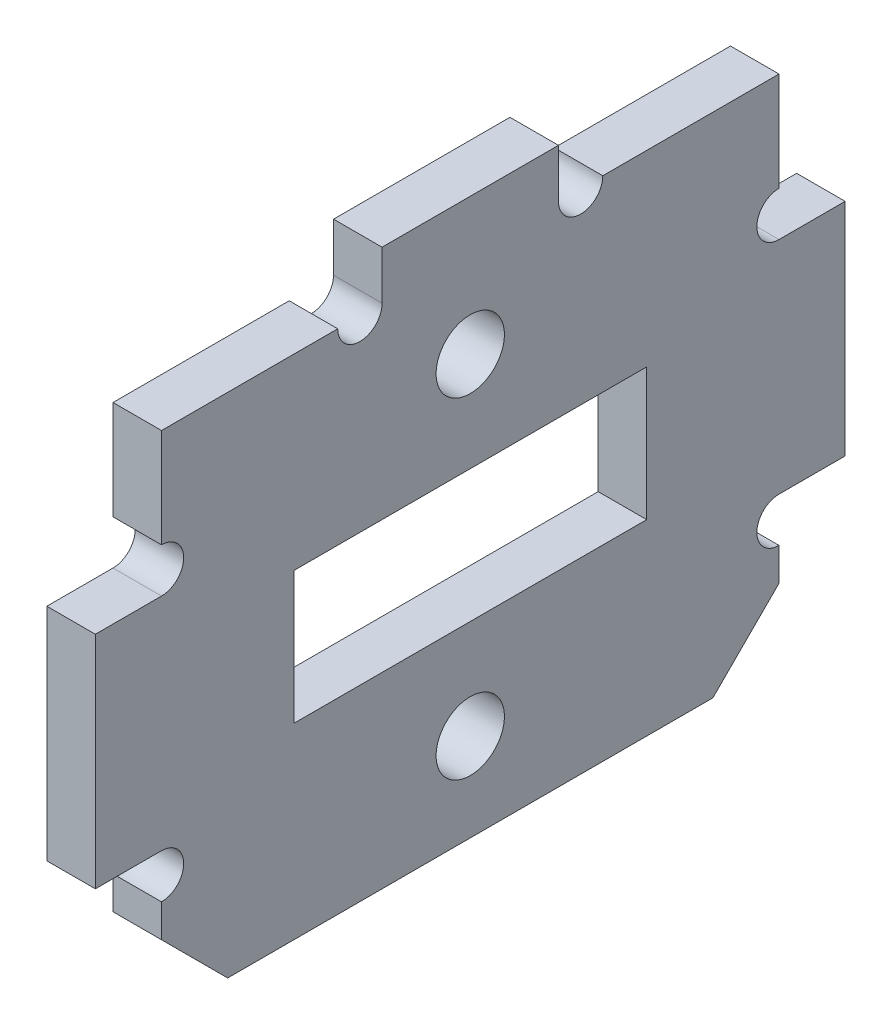
ISO-10303-21;
HEADER;
FILE_DESCRIPTION(('STEP AP214'),'2;1');
FILE_NAME('part.step','',(''),(''),'','','');
FILE_SCHEMA(('AUTOMOTIVE_DESIGN { 1 0 10303 214 1 1 1 1 }'));
ENDSEC;
DATA;
#1=APPLICATION_CONTEXT('core data for automotive mechanical design processes');
#2=APPLICATION_PROTOCOL_DEFINITION('international standard','automotive_design',2000,#1);
#3=PRODUCT_CONTEXT('',#1,'mechanical');
#4=PRODUCT('Part','Part','',(#3));
#5=PRODUCT_RELATED_PRODUCT_CATEGORY('part','',(#4));
#6=PRODUCT_DEFINITION_FORMATION('','',#4);
#7=PRODUCT_DEFINITION_CONTEXT('part definition',#1,'design');
#8=PRODUCT_DEFINITION('design','',#6,#7);
#9=PRODUCT_DEFINITION_SHAPE('','',#8);
#10=(LENGTH_UNIT() NAMED_UNIT(*) SI_UNIT(.MILLI.,.METRE.));
#11=(NAMED_UNIT(*) PLANE_ANGLE_UNIT() SI_UNIT($,.RADIAN.));
#12=(NAMED_UNIT(*) SI_UNIT($,.STERADIAN.) SOLID_ANGLE_UNIT());
#13=UNCERTAINTY_MEASURE_WITH_UNIT(LENGTH_MEASURE(1.E-05),#10,'distance_accuracy_value','');
#14=(GEOMETRIC_REPRESENTATION_CONTEXT(3) GLOBAL_UNCERTAINTY_ASSIGNED_CONTEXT((#13)) GLOBAL_UNIT_ASSIGNED_CONTEXT((#10,
#11,#12)) REPRESENTATION_CONTEXT('',''));
#15=CARTESIAN_POINT('',(0.,0.,0.));
#16=DIRECTION('',(0.,0.,1.));
#17=DIRECTION('',(1.,0.,0.));
#18=AXIS2_PLACEMENT_3D('',#15,#16,#17);
#19=CARTESIAN_POINT('',(2.2,5.,0.));
#20=DIRECTION('',(0.,1.,0.));
#21=DIRECTION('',(0.,0.,1.));
#22=AXIS2_PLACEMENT_3D('',#19,#20,#21);
#23=PLANE('',#22);
#24=DIRECTION('',(0.,0.,-1.));
#25=VECTOR('',#24,1.);
#26=CARTESIAN_POINT('',(0.,5.,0.));
#27=LINE('',#26,#25);
#28=CARTESIAN_POINT('',(0.,5.,-14.));
#29=VERTEX_POINT('',#28);
#30=CARTESIAN_POINT('',(0.,5.,-17.));
#31=VERTEX_POINT('',#30);
#32=EDGE_CURVE('E375',#29,#31,#27,.T.);
#33=ORIENTED_EDGE('',*,*,#32,.F.);
#34=DIRECTION('',(-1.,0.,0.));
#35=VECTOR('',#34,1.);
#36=CARTESIAN_POINT('',(2.2,5.,-14.));
#37=LINE('',#36,#35);
#38=CARTESIAN_POINT('',(2.2,5.,-14.));
#39=VERTEX_POINT('',#38);
#40=EDGE_CURVE('E259',#39,#29,#37,.T.);
#41=ORIENTED_EDGE('',*,*,#40,.F.);
#42=DIRECTION('',(0.,0.,-1.));
#43=VECTOR('',#42,1.);
#44=CARTESIAN_POINT('',(2.2,5.,0.));
#45=LINE('',#44,#43);
#46=CARTESIAN_POINT('',(2.2,5.,-17.));
#47=VERTEX_POINT('',#46);
#48=EDGE_CURVE('E502',#39,#47,#45,.T.);
#49=ORIENTED_EDGE('',*,*,#48,.T.);
#50=DIRECTION('',(-1.,0.,0.));
#51=VECTOR('',#50,1.);
#52=CARTESIAN_POINT('',(2.2,5.,-17.));
#53=LINE('',#52,#51);
#54=EDGE_CURVE('E247',#47,#31,#53,.T.);
#55=ORIENTED_EDGE('',*,*,#54,.T.);
#56=EDGE_LOOP('',(#33,#41,#49,#55));
#57=FACE_BOUND('',#56,.T.);
#58=ADVANCED_FACE('F36',(#57),#23,.T.);
#59=CARTESIAN_POINT('',(2.2,6.005,-14.));
#60=DIRECTION('',(-1.,0.,0.));
#61=DIRECTION('',(0.,0.,1.));
#62=AXIS2_PLACEMENT_3D('',#59,#60,#61);
#63=CYLINDRICAL_SURFACE('',#62,1.005);
#64=CARTESIAN_POINT('',(0.,6.005,-14.));
#65=DIRECTION('',(1.,0.,0.));
#66=DIRECTION('',(0.,0.,-1.));
#67=AXIS2_PLACEMENT_3D('',#64,#65,#66);
#68=CIRCLE('',#67,1.005);
#69=CARTESIAN_POINT('',(0.,7.01,-14.));
#70=VERTEX_POINT('',#69);
#71=EDGE_CURVE('E378',#29,#70,#68,.F.);
#72=ORIENTED_EDGE('',*,*,#71,.T.);
#73=DIRECTION('',(-1.,0.,0.));
#74=VECTOR('',#73,1.);
#75=CARTESIAN_POINT('',(2.2,7.01,-14.));
#76=LINE('',#75,#74);
#77=CARTESIAN_POINT('',(2.2,7.01,-14.));
#78=VERTEX_POINT('',#77);
#79=EDGE_CURVE('E346',#78,#70,#76,.T.);
#80=ORIENTED_EDGE('',*,*,#79,.F.);
#81=CARTESIAN_POINT('',(2.2,6.005,-14.));
#82=DIRECTION('',(1.,0.,0.));
#83=DIRECTION('',(0.,0.,-1.));
#84=AXIS2_PLACEMENT_3D('',#81,#82,#83);
#85=CIRCLE('',#84,1.005);
#86=EDGE_CURVE('E545',#39,#78,#85,.F.);
#87=ORIENTED_EDGE('',*,*,#86,.F.);
#88=ORIENTED_EDGE('',*,*,#40,.T.);
#89=EDGE_LOOP('',(#72,#80,#87,#88));
#90=FACE_BOUND('',#89,.T.);
#91=ADVANCED_FACE('F496',(#90),#63,.F.);
#92=CARTESIAN_POINT('',(2.2,0.,-14.));
#93=DIRECTION('',(0.,0.,1.));
#94=DIRECTION('',(1.,0.,0.));
#95=AXIS2_PLACEMENT_3D('',#92,#93,#94);
#96=PLANE('',#95);
#97=DIRECTION('',(0.,1.,0.));
#98=VECTOR('',#97,1.);
#99=CARTESIAN_POINT('',(0.,0.,-14.));
#100=LINE('',#99,#98);
#101=CARTESIAN_POINT('',(0.,11.5,-14.));
#102=VERTEX_POINT('',#101);
#103=EDGE_CURVE('E381',#70,#102,#100,.T.);
#104=ORIENTED_EDGE('',*,*,#103,.T.);
#105=DIRECTION('',(-1.,0.,0.));
#106=VECTOR('',#105,1.);
#107=CARTESIAN_POINT('',(2.2,11.5,-14.));
#108=LINE('',#107,#106);
#109=CARTESIAN_POINT('',(2.2,11.5,-14.));
#110=VERTEX_POINT('',#109);
#111=EDGE_CURVE('E343',#110,#102,#108,.T.);
#112=ORIENTED_EDGE('',*,*,#111,.F.);
#113=DIRECTION('',(0.,1.,0.));
#114=VECTOR('',#113,1.);
#115=CARTESIAN_POINT('',(2.2,0.,-14.));
#116=LINE('',#115,#114);
#117=EDGE_CURVE('E492',#78,#110,#116,.T.);
#118=ORIENTED_EDGE('',*,*,#117,.F.);
#119=ORIENTED_EDGE('',*,*,#79,.T.);
#120=EDGE_LOOP('',(#104,#112,#118,#119));
#121=FACE_BOUND('',#120,.T.);
#122=ADVANCED_FACE('F490',(#121),#96,.F.);
#123=CARTESIAN_POINT('',(2.2,11.5,0.));
#124=DIRECTION('',(0.,-1.,0.));
#125=DIRECTION('',(0.,0.,-1.));
#126=AXIS2_PLACEMENT_3D('',#123,#124,#125);
#127=PLANE('',#126);
#128=DIRECTION('',(0.,0.,1.));
#129=VECTOR('',#128,1.);
#130=CARTESIAN_POINT('',(0.,11.5,0.));
#131=LINE('',#130,#129);
#132=CARTESIAN_POINT('',(0.,11.5,-6.01));
#133=VERTEX_POINT('',#132);
#134=EDGE_CURVE('E384',#102,#133,#131,.T.);
#135=ORIENTED_EDGE('',*,*,#134,.T.);
#136=DIRECTION('',(-1.,0.,0.));
#137=VECTOR('',#136,1.);
#138=CARTESIAN_POINT('',(2.2,11.5,-6.01));
#139=LINE('',#138,#137);
#140=CARTESIAN_POINT('',(2.2,11.5,-6.01));
#141=VERTEX_POINT('',#140);
#142=EDGE_CURVE('E341',#141,#133,#139,.T.);
#143=ORIENTED_EDGE('',*,*,#142,.F.);
#144=DIRECTION('',(0.,0.,1.));
#145=VECTOR('',#144,1.);
#146=CARTESIAN_POINT('',(2.2,11.5,0.));
#147=LINE('',#146,#145);
#148=EDGE_CURVE('E487',#110,#141,#147,.T.);
#149=ORIENTED_EDGE('',*,*,#148,.F.);
#150=ORIENTED_EDGE('',*,*,#111,.T.);
#151=EDGE_LOOP('',(#135,#143,#149,#150));
#152=FACE_BOUND('',#151,.T.);
#153=ADVANCED_FACE('F486',(#152),#127,.F.);
#154=CARTESIAN_POINT('',(2.2,11.5,-5.005));
#155=DIRECTION('',(-1.,0.,0.));
#156=DIRECTION('',(0.,0.,1.));
#157=AXIS2_PLACEMENT_3D('',#154,#155,#156);
#158=CYLINDRICAL_SURFACE('',#157,1.005);
#159=CARTESIAN_POINT('',(0.,11.5,-5.005));
#160=DIRECTION('',(1.,0.,0.));
#161=DIRECTION('',(0.,0.,-1.));
#162=AXIS2_PLACEMENT_3D('',#159,#160,#161);
#163=CIRCLE('',#162,1.005);
#164=CARTESIAN_POINT('',(0.,11.5,-4.));
#165=VERTEX_POINT('',#164);
#166=EDGE_CURVE('E387',#165,#133,#163,.T.);
#167=ORIENTED_EDGE('',*,*,#166,.F.);
#168=DIRECTION('',(-1.,0.,0.));
#169=VECTOR('',#168,1.);
#170=CARTESIAN_POINT('',(2.2,11.5,-4.));
#171=LINE('',#170,#169);
#172=CARTESIAN_POINT('',(2.2,11.5,-4.));
#173=VERTEX_POINT('',#172);
#174=EDGE_CURVE('E339',#173,#165,#171,.T.);
#175=ORIENTED_EDGE('',*,*,#174,.F.);
#176=CARTESIAN_POINT('',(2.2,11.5,-5.005));
#177=DIRECTION('',(1.,0.,0.));
#178=DIRECTION('',(0.,0.,-1.));
#179=AXIS2_PLACEMENT_3D('',#176,#177,#178);
#180=CIRCLE('',#179,1.005);
#181=EDGE_CURVE('E541',#173,#141,#180,.T.);
#182=ORIENTED_EDGE('',*,*,#181,.T.);
#183=ORIENTED_EDGE('',*,*,#142,.T.);
#184=EDGE_LOOP('',(#167,#175,#182,#183));
#185=FACE_BOUND('',#184,.T.);
#186=ADVANCED_FACE('F481',(#185),#158,.F.);
#187=CARTESIAN_POINT('',(2.2,0.,-4.));
#188=DIRECTION('',(0.,0.,-1.));
#189=DIRECTION('',(-1.,0.,0.));
#190=AXIS2_PLACEMENT_3D('',#187,#188,#189);
#191=PLANE('',#190);
#192=DIRECTION('',(0.,-1.,0.));
#193=VECTOR('',#192,1.);
#194=CARTESIAN_POINT('',(0.,0.,-4.));
#195=LINE('',#194,#193);
#196=CARTESIAN_POINT('',(0.,13.7,-4.));
#197=VERTEX_POINT('',#196);
#198=EDGE_CURVE('E390',#197,#165,#195,.T.);
#199=ORIENTED_EDGE('',*,*,#198,.F.);
#200=DIRECTION('',(-1.,0.,0.));
#201=VECTOR('',#200,1.);
#202=CARTESIAN_POINT('',(2.2,13.7,-4.));
#203=LINE('',#202,#201);
#204=CARTESIAN_POINT('',(2.2,13.7,-4.));
#205=VERTEX_POINT('',#204);
#206=EDGE_CURVE('E337',#205,#197,#203,.T.);
#207=ORIENTED_EDGE('',*,*,#206,.F.);
#208=DIRECTION('',(0.,-1.,0.));
#209=VECTOR('',#208,1.);
#210=CARTESIAN_POINT('',(2.2,0.,-4.));
#211=LINE('',#210,#209);
#212=EDGE_CURVE('E477',#205,#173,#211,.T.);
#213=ORIENTED_EDGE('',*,*,#212,.T.);
#214=ORIENTED_EDGE('',*,*,#174,.T.);
#215=EDGE_LOOP('',(#199,#207,#213,#214));
#216=FACE_BOUND('',#215,.T.);
#217=ADVANCED_FACE('F475',(#216),#191,.T.);
#218=CARTESIAN_POINT('',(2.2,13.7,0.));
#219=DIRECTION('',(0.,1.,0.));
#220=DIRECTION('',(0.,0.,1.));
#221=AXIS2_PLACEMENT_3D('',#218,#219,#220);
#222=PLANE('',#221);
#223=DIRECTION('',(0.,0.,-1.));
#224=VECTOR('',#223,1.);
#225=CARTESIAN_POINT('',(0.,13.7,0.));
#226=LINE('',#225,#224);
#227=CARTESIAN_POINT('',(0.,13.7,4.));
#228=VERTEX_POINT('',#227);
#229=EDGE_CURVE('E393',#228,#197,#226,.T.);
#230=ORIENTED_EDGE('',*,*,#229,.F.);
#231=DIRECTION('',(-1.,0.,0.));
#232=VECTOR('',#231,1.);
#233=CARTESIAN_POINT('',(2.2,13.7,4.));
#234=LINE('',#233,#232);
#235=CARTESIAN_POINT('',(2.2,13.7,4.));
#236=VERTEX_POINT('',#235);
#237=EDGE_CURVE('E335',#236,#228,#234,.T.);
#238=ORIENTED_EDGE('',*,*,#237,.F.);
#239=DIRECTION('',(0.,0.,-1.));
#240=VECTOR('',#239,1.);
#241=CARTESIAN_POINT('',(2.2,13.7,0.));
#242=LINE('',#241,#240);
#243=EDGE_CURVE('E471',#236,#205,#242,.T.);
#244=ORIENTED_EDGE('',*,*,#243,.T.);
#245=ORIENTED_EDGE('',*,*,#206,.T.);
#246=EDGE_LOOP('',(#230,#238,#244,#245));
#247=FACE_BOUND('',#246,.T.);
#248=ADVANCED_FACE('F468',(#247),#222,.T.);
#249=CARTESIAN_POINT('',(2.2,0.,4.));
#250=DIRECTION('',(0.,0.,1.));
#251=DIRECTION('',(1.,0.,0.));
#252=AXIS2_PLACEMENT_3D('',#249,#250,#251);
#253=PLANE('',#252);
#254=DIRECTION('',(0.,1.,0.));
#255=VECTOR('',#254,1.);
#256=CARTESIAN_POINT('',(0.,0.,4.));
#257=LINE('',#256,#255);
#258=CARTESIAN_POINT('',(0.,11.5,4.));
#259=VERTEX_POINT('',#258);
#260=EDGE_CURVE('E396',#259,#228,#257,.T.);
#261=ORIENTED_EDGE('',*,*,#260,.F.);
#262=DIRECTION('',(-1.,0.,0.));
#263=VECTOR('',#262,1.);
#264=CARTESIAN_POINT('',(2.2,11.5,4.));
#265=LINE('',#264,#263);
#266=CARTESIAN_POINT('',(2.2,11.5,4.));
#267=VERTEX_POINT('',#266);
#268=EDGE_CURVE('E333',#267,#259,#265,.T.);
#269=ORIENTED_EDGE('',*,*,#268,.F.);
#270=DIRECTION('',(0.,1.,0.));
#271=VECTOR('',#270,1.);
#272=CARTESIAN_POINT('',(2.2,0.,4.));
#273=LINE('',#272,#271);
#274=EDGE_CURVE('E537',#267,#236,#273,.T.);
#275=ORIENTED_EDGE('',*,*,#274,.T.);
#276=ORIENTED_EDGE('',*,*,#237,.T.);
#277=EDGE_LOOP('',(#261,#269,#275,#276));
#278=FACE_BOUND('',#277,.T.);
#279=ADVANCED_FACE('F464',(#278),#253,.T.);
#280=CARTESIAN_POINT('',(2.2,11.5,5.005));
#281=DIRECTION('',(-1.,0.,0.));
#282=DIRECTION('',(0.,0.,1.));
#283=AXIS2_PLACEMENT_3D('',#280,#281,#282);
#284=CYLINDRICAL_SURFACE('',#283,1.005);
#285=CARTESIAN_POINT('',(0.,11.5,5.005));
#286=DIRECTION('',(1.,0.,0.));
#287=DIRECTION('',(0.,0.,-1.));
#288=AXIS2_PLACEMENT_3D('',#285,#286,#287);
#289=CIRCLE('',#288,1.005);
#290=CARTESIAN_POINT('',(0.,11.5,6.01));
#291=VERTEX_POINT('',#290);
#292=EDGE_CURVE('E399',#291,#259,#289,.T.);
#293=ORIENTED_EDGE('',*,*,#292,.F.);
#294=DIRECTION('',(-1.,0.,0.));
#295=VECTOR('',#294,1.);
#296=CARTESIAN_POINT('',(2.2,11.5,6.01));
#297=LINE('',#296,#295);
#298=CARTESIAN_POINT('',(2.2,11.5,6.01));
#299=VERTEX_POINT('',#298);
#300=EDGE_CURVE('E331',#299,#291,#297,.T.);
#301=ORIENTED_EDGE('',*,*,#300,.F.);
#302=CARTESIAN_POINT('',(2.2,11.5,5.005));
#303=DIRECTION('',(1.,0.,0.));
#304=DIRECTION('',(0.,0.,-1.));
#305=AXIS2_PLACEMENT_3D('',#302,#303,#304);
#306=CIRCLE('',#305,1.005);
#307=EDGE_CURVE('E460',#299,#267,#306,.T.);
#308=ORIENTED_EDGE('',*,*,#307,.T.);
#309=ORIENTED_EDGE('',*,*,#268,.T.);
#310=EDGE_LOOP('',(#293,#301,#308,#309));
#311=FACE_BOUND('',#310,.T.);
#312=ADVANCED_FACE('F455',(#311),#284,.F.);
#313=CARTESIAN_POINT('',(2.2,11.5,0.));
#314=DIRECTION('',(0.,-1.,0.));
#315=DIRECTION('',(0.,0.,-1.));
#316=AXIS2_PLACEMENT_3D('',#313,#314,#315);
#317=PLANE('',#316);
#318=DIRECTION('',(0.,0.,1.));
#319=VECTOR('',#318,1.);
#320=CARTESIAN_POINT('',(0.,11.5,0.));
#321=LINE('',#320,#319);
#322=CARTESIAN_POINT('',(0.,11.5,14.));
#323=VERTEX_POINT('',#322);
#324=EDGE_CURVE('E402',#291,#323,#321,.T.);
#325=ORIENTED_EDGE('',*,*,#324,.T.);
#326=DIRECTION('',(-1.,0.,0.));
#327=VECTOR('',#326,1.);
#328=CARTESIAN_POINT('',(2.2,11.5,14.));
#329=LINE('',#328,#327);
#330=CARTESIAN_POINT('',(2.2,11.5,14.));
#331=VERTEX_POINT('',#330);
#332=EDGE_CURVE('E329',#331,#323,#329,.T.);
#333=ORIENTED_EDGE('',*,*,#332,.F.);
#334=DIRECTION('',(0.,0.,1.));
#335=VECTOR('',#334,1.);
#336=CARTESIAN_POINT('',(2.2,11.5,0.));
#337=LINE('',#336,#335);
#338=EDGE_CURVE('E534',#299,#331,#337,.T.);
#339=ORIENTED_EDGE('',*,*,#338,.F.);
#340=ORIENTED_EDGE('',*,*,#300,.T.);
#341=EDGE_LOOP('',(#325,#333,#339,#340));
#342=FACE_BOUND('',#341,.T.);
#343=ADVANCED_FACE('F622',(#342),#317,.F.);
#344=CARTESIAN_POINT('',(2.2,0.,14.));
#345=DIRECTION('',(0.,0.,1.));
#346=DIRECTION('',(1.,0.,0.));
#347=AXIS2_PLACEMENT_3D('',#344,#345,#346);
#348=PLANE('',#347);
#349=DIRECTION('',(0.,1.,0.));
#350=VECTOR('',#349,1.);
#351=CARTESIAN_POINT('',(0.,0.,14.));
#352=LINE('',#351,#350);
#353=CARTESIAN_POINT('',(0.,7.01,14.));
#354=VERTEX_POINT('',#353);
#355=EDGE_CURVE('E405',#354,#323,#352,.T.);
#356=ORIENTED_EDGE('',*,*,#355,.F.);
#357=DIRECTION('',(-1.,0.,0.));
#358=VECTOR('',#357,1.);
#359=CARTESIAN_POINT('',(2.2,7.01,14.));
#360=LINE('',#359,#358);
#361=CARTESIAN_POINT('',(2.2,7.01,14.));
#362=VERTEX_POINT('',#361);
#363=EDGE_CURVE('E327',#362,#354,#360,.T.);
#364=ORIENTED_EDGE('',*,*,#363,.F.);
#365=DIRECTION('',(0.,1.,0.));
#366=VECTOR('',#365,1.);
#367=CARTESIAN_POINT('',(2.2,0.,14.));
#368=LINE('',#367,#366);
#369=EDGE_CURVE('E532',#362,#331,#368,.T.);
#370=ORIENTED_EDGE('',*,*,#369,.T.);
#371=ORIENTED_EDGE('',*,*,#332,.T.);
#372=EDGE_LOOP('',(#356,#364,#370,#371));
#373=FACE_BOUND('',#372,.T.);
#374=ADVANCED_FACE('F449',(#373),#348,.T.);
#375=CARTESIAN_POINT('',(2.2,6.005,14.));
#376=DIRECTION('',(-1.,0.,0.));
#377=DIRECTION('',(0.,0.,1.));
#378=AXIS2_PLACEMENT_3D('',#375,#376,#377);
#379=CYLINDRICAL_SURFACE('',#378,1.005);
#380=CARTESIAN_POINT('',(0.,6.005,14.));
#381=DIRECTION('',(1.,0.,0.));
#382=DIRECTION('',(0.,0.,-1.));
#383=AXIS2_PLACEMENT_3D('',#380,#381,#382);
#384=CIRCLE('',#383,1.005);
#385=CARTESIAN_POINT('',(0.,5.,14.));
#386=VERTEX_POINT('',#385);
#387=EDGE_CURVE('E408',#386,#354,#384,.T.);
#388=ORIENTED_EDGE('',*,*,#387,.F.);
#389=DIRECTION('',(-1.,0.,0.));
#390=VECTOR('',#389,1.);
#391=CARTESIAN_POINT('',(2.2,5.,14.));
#392=LINE('',#391,#390);
#393=CARTESIAN_POINT('',(2.2,5.,14.));
#394=VERTEX_POINT('',#393);
#395=EDGE_CURVE('E325',#394,#386,#392,.T.);
#396=ORIENTED_EDGE('',*,*,#395,.F.);
#397=CARTESIAN_POINT('',(2.2,6.005,14.));
#398=DIRECTION('',(1.,0.,0.));
#399=DIRECTION('',(0.,0.,-1.));
#400=AXIS2_PLACEMENT_3D('',#397,#398,#399);
#401=CIRCLE('',#400,1.005);
#402=EDGE_CURVE('E445',#394,#362,#401,.T.);
#403=ORIENTED_EDGE('',*,*,#402,.T.);
#404=ORIENTED_EDGE('',*,*,#363,.T.);
#405=EDGE_LOOP('',(#388,#396,#403,#404));
#406=FACE_BOUND('',#405,.T.);
#407=ADVANCED_FACE('F440',(#406),#379,.F.);
#408=CARTESIAN_POINT('',(2.2,5.,0.));
#409=DIRECTION('',(0.,-1.,0.));
#410=DIRECTION('',(0.,0.,-1.));
#411=AXIS2_PLACEMENT_3D('',#408,#409,#410);
#412=PLANE('',#411);
#413=DIRECTION('',(0.,0.,1.));
#414=VECTOR('',#413,1.);
#415=CARTESIAN_POINT('',(0.,5.,0.));
#416=LINE('',#415,#414);
#417=CARTESIAN_POINT('',(0.,5.,17.));
#418=VERTEX_POINT('',#417);
#419=EDGE_CURVE('E411',#386,#418,#416,.T.);
#420=ORIENTED_EDGE('',*,*,#419,.T.);
#421=DIRECTION('',(-1.,0.,0.));
#422=VECTOR('',#421,1.);
#423=CARTESIAN_POINT('',(2.2,5.,17.));
#424=LINE('',#423,#422);
#425=CARTESIAN_POINT('',(2.2,5.,17.));
#426=VERTEX_POINT('',#425);
#427=EDGE_CURVE('E322',#426,#418,#424,.T.);
#428=ORIENTED_EDGE('',*,*,#427,.F.);
#429=DIRECTION('',(0.,0.,1.));
#430=VECTOR('',#429,1.);
#431=CARTESIAN_POINT('',(2.2,5.,0.));
#432=LINE('',#431,#430);
#433=EDGE_CURVE('E528',#394,#426,#432,.T.);
#434=ORIENTED_EDGE('',*,*,#433,.F.);
#435=ORIENTED_EDGE('',*,*,#395,.T.);
#436=EDGE_LOOP('',(#420,#428,#434,#435));
#437=FACE_BOUND('',#436,.T.);
#438=ADVANCED_FACE('F615',(#437),#412,.F.);
#439=CARTESIAN_POINT('',(2.2,0.,17.));
#440=DIRECTION('',(0.,0.,-1.));
#441=DIRECTION('',(-1.,0.,0.));
#442=AXIS2_PLACEMENT_3D('',#439,#440,#441);
#443=PLANE('',#442);
#444=DIRECTION('',(0.,-1.,0.));
#445=VECTOR('',#444,1.);
#446=CARTESIAN_POINT('',(0.,0.,17.));
#447=LINE('',#446,#445);
#448=CARTESIAN_POINT('',(0.,-5.,17.));
#449=VERTEX_POINT('',#448);
#450=EDGE_CURVE('E414',#418,#449,#447,.T.);
#451=ORIENTED_EDGE('',*,*,#450,.T.);
#452=DIRECTION('',(-1.,0.,0.));
#453=VECTOR('',#452,1.);
#454=CARTESIAN_POINT('',(2.2,-5.,17.));
#455=LINE('',#454,#453);
#456=CARTESIAN_POINT('',(2.2,-5.,17.));
#457=VERTEX_POINT('',#456);
#458=EDGE_CURVE('E319',#457,#449,#455,.T.);
#459=ORIENTED_EDGE('',*,*,#458,.F.);
#460=DIRECTION('',(0.,-1.,0.));
#461=VECTOR('',#460,1.);
#462=CARTESIAN_POINT('',(2.2,0.,17.));
#463=LINE('',#462,#461);
#464=EDGE_CURVE('E526',#426,#457,#463,.T.);
#465=ORIENTED_EDGE('',*,*,#464,.F.);
#466=ORIENTED_EDGE('',*,*,#427,.T.);
#467=EDGE_LOOP('',(#451,#459,#465,#466));
#468=FACE_BOUND('',#467,.T.);
#469=ADVANCED_FACE('F434',(#468),#443,.F.);
#470=CARTESIAN_POINT('',(2.2,-5.,0.));
#471=DIRECTION('',(0.,1.,0.));
#472=DIRECTION('',(0.,0.,1.));
#473=AXIS2_PLACEMENT_3D('',#470,#471,#472);
#474=PLANE('',#473);
#475=DIRECTION('',(0.,0.,-1.));
#476=VECTOR('',#475,1.);
#477=CARTESIAN_POINT('',(0.,-5.,0.));
#478=LINE('',#477,#476);
#479=CARTESIAN_POINT('',(0.,-5.,14.));
#480=VERTEX_POINT('',#479);
#481=EDGE_CURVE('E417',#449,#480,#478,.T.);
#482=ORIENTED_EDGE('',*,*,#481,.T.);
#483=DIRECTION('',(-1.,0.,0.));
#484=VECTOR('',#483,1.);
#485=CARTESIAN_POINT('',(2.2,-5.,14.));
#486=LINE('',#485,#484);
#487=CARTESIAN_POINT('',(2.2,-5.,14.));
#488=VERTEX_POINT('',#487);
#489=EDGE_CURVE('E317',#488,#480,#486,.T.);
#490=ORIENTED_EDGE('',*,*,#489,.F.);
#491=DIRECTION('',(0.,0.,-1.));
#492=VECTOR('',#491,1.);
#493=CARTESIAN_POINT('',(2.2,-5.,0.));
#494=LINE('',#493,#492);
#495=EDGE_CURVE('E431',#457,#488,#494,.T.);
#496=ORIENTED_EDGE('',*,*,#495,.F.);
#497=ORIENTED_EDGE('',*,*,#458,.T.);
#498=EDGE_LOOP('',(#482,#490,#496,#497));
#499=FACE_BOUND('',#498,.T.);
#500=ADVANCED_FACE('F429',(#499),#474,.F.);
#501=CARTESIAN_POINT('',(2.2,-6.005,14.));
#502=DIRECTION('',(-1.,0.,0.));
#503=DIRECTION('',(0.,0.,1.));
#504=AXIS2_PLACEMENT_3D('',#501,#502,#503);
#505=CYLINDRICAL_SURFACE('',#504,1.005);
#506=CARTESIAN_POINT('',(0.,-6.005,14.));
#507=DIRECTION('',(1.,0.,0.));
#508=DIRECTION('',(0.,0.,-1.));
#509=AXIS2_PLACEMENT_3D('',#506,#507,#508);
#510=CIRCLE('',#509,1.005);
#511=CARTESIAN_POINT('',(0.,-7.01,14.));
#512=VERTEX_POINT('',#511);
#513=EDGE_CURVE('E299',#512,#480,#510,.T.);
#514=ORIENTED_EDGE('',*,*,#513,.F.);
#515=DIRECTION('',(-1.,0.,0.));
#516=VECTOR('',#515,1.);
#517=CARTESIAN_POINT('',(2.2,-7.01,14.));
#518=LINE('',#517,#516);
#519=CARTESIAN_POINT('',(2.2,-7.01,14.));
#520=VERTEX_POINT('',#519);
#521=EDGE_CURVE('E314',#520,#512,#518,.T.);
#522=ORIENTED_EDGE('',*,*,#521,.F.);
#523=CARTESIAN_POINT('',(2.2,-6.005,14.));
#524=DIRECTION('',(1.,0.,0.));
#525=DIRECTION('',(0.,0.,-1.));
#526=AXIS2_PLACEMENT_3D('',#523,#524,#525);
#527=CIRCLE('',#526,1.005);
#528=EDGE_CURVE('E427',#520,#488,#527,.T.);
#529=ORIENTED_EDGE('',*,*,#528,.T.);
#530=ORIENTED_EDGE('',*,*,#489,.T.);
#531=EDGE_LOOP('',(#514,#522,#529,#530));
#532=FACE_BOUND('',#531,.T.);
#533=ADVANCED_FACE('F423',(#532),#505,.F.);
#534=CARTESIAN_POINT('',(2.2,0.,14.));
#535=DIRECTION('',(0.,0.,1.));
#536=DIRECTION('',(0.,-1.,0.));
#537=AXIS2_PLACEMENT_3D('',#534,#535,#536);
#538=PLANE('',#537);
#539=DIRECTION('',(0.,1.,0.));
#540=VECTOR('',#539,1.);
#541=CARTESIAN_POINT('',(0.,0.,14.));
#542=LINE('',#541,#540);
#543=CARTESIAN_POINT('',(0.,-8.49999999999998,14.));
#544=VERTEX_POINT('',#543);
#545=EDGE_CURVE('E295',#544,#512,#542,.T.);
#546=ORIENTED_EDGE('',*,*,#545,.F.);
#547=DIRECTION('',(1.,0.,0.));
#548=VECTOR('',#547,1.);
#549=CARTESIAN_POINT('',(2.2,-8.49999999999998,14.));
#550=LINE('',#549,#548);
#551=CARTESIAN_POINT('',(2.2,-8.49999999999998,14.));
#552=VERTEX_POINT('',#551);
#553=EDGE_CURVE('E11',#544,#552,#550,.T.);
#554=ORIENTED_EDGE('',*,*,#553,.T.);
#555=DIRECTION('',(0.,1.,0.));
#556=VECTOR('',#555,1.);
#557=CARTESIAN_POINT('',(2.2,0.,14.));
#558=LINE('',#557,#556);
#559=EDGE_CURVE('E522',#552,#520,#558,.T.);
#560=ORIENTED_EDGE('',*,*,#559,.T.);
#561=ORIENTED_EDGE('',*,*,#521,.T.);
#562=EDGE_LOOP('',(#546,#554,#560,#561));
#563=FACE_BOUND('',#562,.T.);
#564=ADVANCED_FACE('F606',(#563),#538,.T.);
#565=CARTESIAN_POINT('',(2.2,-11.5,0.));
#566=DIRECTION('',(0.,-1.,0.));
#567=DIRECTION('',(0.,0.,-1.));
#568=AXIS2_PLACEMENT_3D('',#565,#566,#567);
#569=PLANE('',#568);
#570=DIRECTION('',(0.,0.,1.));
#571=VECTOR('',#570,1.);
#572=CARTESIAN_POINT('',(0.,-11.5,0.));
#573=LINE('',#572,#571);
#574=CARTESIAN_POINT('',(0.,-11.5,-11.));
#575=VERTEX_POINT('',#574);
#576=CARTESIAN_POINT('',(0.,-11.5,11.));
#577=VERTEX_POINT('',#576);
#578=EDGE_CURVE('E289',#575,#577,#573,.T.);
#579=ORIENTED_EDGE('',*,*,#578,.F.);
#580=DIRECTION('',(1.,0.,0.));
#581=VECTOR('',#580,1.);
#582=CARTESIAN_POINT('',(2.2,-11.5,-11.));
#583=LINE('',#582,#581);
#584=CARTESIAN_POINT('',(2.2,-11.5,-11.));
#585=VERTEX_POINT('',#584);
#586=EDGE_CURVE('E266',#575,#585,#583,.T.);
#587=ORIENTED_EDGE('',*,*,#586,.T.);
#588=DIRECTION('',(0.,0.,1.));
#589=VECTOR('',#588,1.);
#590=CARTESIAN_POINT('',(2.2,-11.5,0.));
#591=LINE('',#590,#589);
#592=CARTESIAN_POINT('',(2.2,-11.5,11.));
#593=VERTEX_POINT('',#592);
#594=EDGE_CURVE('E272',#585,#593,#591,.T.);
#595=ORIENTED_EDGE('',*,*,#594,.T.);
#596=DIRECTION('',(-1.,0.,0.));
#597=VECTOR('',#596,1.);
#598=CARTESIAN_POINT('',(2.2,-11.5,11.));
#599=LINE('',#598,#597);
#600=EDGE_CURVE('E263',#593,#577,#599,.T.);
#601=ORIENTED_EDGE('',*,*,#600,.T.);
#602=EDGE_LOOP('',(#579,#587,#595,#601));
#603=FACE_BOUND('',#602,.T.);
#604=ADVANCED_FACE('F293',(#603),#569,.T.);
#605=CARTESIAN_POINT('',(2.2,0.,-14.));
#606=DIRECTION('',(0.,0.,1.));
#607=DIRECTION('',(0.,-1.,0.));
#608=AXIS2_PLACEMENT_3D('',#605,#606,#607);
#609=PLANE('',#608);
#610=DIRECTION('',(0.,1.,0.));
#611=VECTOR('',#610,1.);
#612=CARTESIAN_POINT('',(2.2,0.,-14.));
#613=LINE('',#612,#611);
#614=CARTESIAN_POINT('',(2.2,-8.5,-14.));
#615=VERTEX_POINT('',#614);
#616=CARTESIAN_POINT('',(2.2,-7.01,-14.));
#617=VERTEX_POINT('',#616);
#618=EDGE_CURVE('E270',#615,#617,#613,.T.);
#619=ORIENTED_EDGE('',*,*,#618,.F.);
#620=DIRECTION('',(-1.,0.,0.));
#621=VECTOR('',#620,1.);
#622=CARTESIAN_POINT('',(0.,-8.5,-14.));
#623=LINE('',#622,#621);
#624=CARTESIAN_POINT('',(0.,-8.5,-14.));
#625=VERTEX_POINT('',#624);
#626=EDGE_CURVE('E255',#615,#625,#623,.T.);
#627=ORIENTED_EDGE('',*,*,#626,.T.);
#628=DIRECTION('',(0.,1.,0.));
#629=VECTOR('',#628,1.);
#630=CARTESIAN_POINT('',(0.,0.,-14.));
#631=LINE('',#630,#629);
#632=CARTESIAN_POINT('',(0.,-7.01,-14.));
#633=VERTEX_POINT('',#632);
#634=EDGE_CURVE('E291',#625,#633,#631,.T.);
#635=ORIENTED_EDGE('',*,*,#634,.T.);
#636=DIRECTION('',(-1.,0.,0.));
#637=VECTOR('',#636,1.);
#638=CARTESIAN_POINT('',(2.2,-7.01,-14.));
#639=LINE('',#638,#637);
#640=EDGE_CURVE('E281',#617,#633,#639,.T.);
#641=ORIENTED_EDGE('',*,*,#640,.F.);
#642=EDGE_LOOP('',(#619,#627,#635,#641));
#643=FACE_BOUND('',#642,.T.);
#644=ADVANCED_FACE('F278',(#643),#609,.F.);
#645=CARTESIAN_POINT('',(2.2,-6.005,-14.));
#646=DIRECTION('',(-1.,0.,0.));
#647=DIRECTION('',(0.,0.,1.));
#648=AXIS2_PLACEMENT_3D('',#645,#646,#647);
#649=CYLINDRICAL_SURFACE('',#648,1.005);
#650=CARTESIAN_POINT('',(0.,-6.005,-14.));
#651=DIRECTION('',(1.,0.,0.));
#652=DIRECTION('',(0.,0.,-1.));
#653=AXIS2_PLACEMENT_3D('',#650,#651,#652);
#654=CIRCLE('',#653,1.005);
#655=CARTESIAN_POINT('',(0.,-5.,-14.));
#656=VERTEX_POINT('',#655);
#657=EDGE_CURVE('E297',#633,#656,#654,.F.);
#658=ORIENTED_EDGE('',*,*,#657,.T.);
#659=DIRECTION('',(-1.,0.,0.));
#660=VECTOR('',#659,1.);
#661=CARTESIAN_POINT('',(2.2,-5.,-14.));
#662=LINE('',#661,#660);
#663=CARTESIAN_POINT('',(2.2,-5.,-14.));
#664=VERTEX_POINT('',#663);
#665=EDGE_CURVE('E311',#664,#656,#662,.T.);
#666=ORIENTED_EDGE('',*,*,#665,.F.);
#667=CARTESIAN_POINT('',(2.2,-6.005,-14.));
#668=DIRECTION('',(1.,0.,0.));
#669=DIRECTION('',(0.,0.,-1.));
#670=AXIS2_PLACEMENT_3D('',#667,#668,#669);
#671=CIRCLE('',#670,1.005);
#672=EDGE_CURVE('E282',#617,#664,#671,.F.);
#673=ORIENTED_EDGE('',*,*,#672,.F.);
#674=ORIENTED_EDGE('',*,*,#640,.T.);
#675=EDGE_LOOP('',(#658,#666,#673,#674));
#676=FACE_BOUND('',#675,.T.);
#677=ADVANCED_FACE('F515',(#676),#649,.F.);
#678=CARTESIAN_POINT('',(2.2,-5.,0.));
#679=DIRECTION('',(0.,-1.,0.));
#680=DIRECTION('',(0.,0.,-1.));
#681=AXIS2_PLACEMENT_3D('',#678,#679,#680);
#682=PLANE('',#681);
#683=DIRECTION('',(0.,0.,1.));
#684=VECTOR('',#683,1.);
#685=CARTESIAN_POINT('',(0.,-5.,0.));
#686=LINE('',#685,#684);
#687=CARTESIAN_POINT('',(0.,-5.,-17.));
#688=VERTEX_POINT('',#687);
#689=EDGE_CURVE('E305',#688,#656,#686,.T.);
#690=ORIENTED_EDGE('',*,*,#689,.F.);
#691=DIRECTION('',(-1.,0.,0.));
#692=VECTOR('',#691,1.);
#693=CARTESIAN_POINT('',(2.2,-5.,-17.));
#694=LINE('',#693,#692);
#695=CARTESIAN_POINT('',(2.2,-5.,-17.));
#696=VERTEX_POINT('',#695);
#697=EDGE_CURVE('E249',#696,#688,#694,.T.);
#698=ORIENTED_EDGE('',*,*,#697,.F.);
#699=DIRECTION('',(0.,0.,1.));
#700=VECTOR('',#699,1.);
#701=CARTESIAN_POINT('',(2.2,-5.,0.));
#702=LINE('',#701,#700);
#703=EDGE_CURVE('E513',#696,#664,#702,.T.);
#704=ORIENTED_EDGE('',*,*,#703,.T.);
#705=ORIENTED_EDGE('',*,*,#665,.T.);
#706=EDGE_LOOP('',(#690,#698,#704,#705));
#707=FACE_BOUND('',#706,.T.);
#708=ADVANCED_FACE('F509',(#707),#682,.T.);
#709=CARTESIAN_POINT('',(2.2,-3.,0.));
#710=DIRECTION('',(0.,-1.,0.));
#711=DIRECTION('',(0.,0.,-1.));
#712=AXIS2_PLACEMENT_3D('',#709,#710,#711);
#713=PLANE('',#712);
#714=DIRECTION('',(0.,0.,1.));
#715=VECTOR('',#714,1.);
#716=CARTESIAN_POINT('',(0.,-3.,0.));
#717=LINE('',#716,#715);
#718=CARTESIAN_POINT('',(0.,-3.,-8.));
#719=VERTEX_POINT('',#718);
#720=CARTESIAN_POINT('',(0.,-3.,8.));
#721=VERTEX_POINT('',#720);
#722=EDGE_CURVE('E246',#719,#721,#717,.T.);
#723=ORIENTED_EDGE('',*,*,#722,.T.);
#724=DIRECTION('',(-1.,0.,0.));
#725=VECTOR('',#724,1.);
#726=CARTESIAN_POINT('',(2.2,-3.,8.));
#727=LINE('',#726,#725);
#728=CARTESIAN_POINT('',(2.2,-3.,8.));
#729=VERTEX_POINT('',#728);
#730=EDGE_CURVE('E226',#729,#721,#727,.T.);
#731=ORIENTED_EDGE('',*,*,#730,.F.);
#732=DIRECTION('',(0.,0.,1.));
#733=VECTOR('',#732,1.);
#734=CARTESIAN_POINT('',(2.2,-3.,0.));
#735=LINE('',#734,#733);
#736=CARTESIAN_POINT('',(2.2,-3.,-8.));
#737=VERTEX_POINT('',#736);
#738=EDGE_CURVE('E233',#737,#729,#735,.T.);
#739=ORIENTED_EDGE('',*,*,#738,.F.);
#740=DIRECTION('',(-1.,0.,0.));
#741=VECTOR('',#740,1.);
#742=CARTESIAN_POINT('',(2.2,-3.,-8.));
#743=LINE('',#742,#741);
#744=EDGE_CURVE('E350',#737,#719,#743,.T.);
#745=ORIENTED_EDGE('',*,*,#744,.T.);
#746=EDGE_LOOP('',(#723,#731,#739,#745));
#747=FACE_BOUND('',#746,.T.);
#748=ADVANCED_FACE('F244',(#747),#713,.F.);
#749=CARTESIAN_POINT('',(2.2,0.,8.));
#750=DIRECTION('',(0.,0.,1.));
#751=DIRECTION('',(1.,0.,0.));
#752=AXIS2_PLACEMENT_3D('',#749,#750,#751);
#753=PLANE('',#752);
#754=DIRECTION('',(0.,1.,0.));
#755=VECTOR('',#754,1.);
#756=CARTESIAN_POINT('',(0.,0.,8.));
#757=LINE('',#756,#755);
#758=CARTESIAN_POINT('',(0.,3.,8.));
#759=VERTEX_POINT('',#758);
#760=EDGE_CURVE('E363',#721,#759,#757,.T.);
#761=ORIENTED_EDGE('',*,*,#760,.T.);
#762=DIRECTION('',(-1.,0.,0.));
#763=VECTOR('',#762,1.);
#764=CARTESIAN_POINT('',(2.2,3.,8.));
#765=LINE('',#764,#763);
#766=CARTESIAN_POINT('',(2.2,3.,8.));
#767=VERTEX_POINT('',#766);
#768=EDGE_CURVE('E228',#767,#759,#765,.T.);
#769=ORIENTED_EDGE('',*,*,#768,.F.);
#770=DIRECTION('',(0.,1.,0.));
#771=VECTOR('',#770,1.);
#772=CARTESIAN_POINT('',(2.2,0.,8.));
#773=LINE('',#772,#771);
#774=EDGE_CURVE('E221',#729,#767,#773,.T.);
#775=ORIENTED_EDGE('',*,*,#774,.F.);
#776=ORIENTED_EDGE('',*,*,#730,.T.);
#777=EDGE_LOOP('',(#761,#769,#775,#776));
#778=FACE_BOUND('',#777,.T.);
#779=ADVANCED_FACE('F224',(#778),#753,.F.);
#780=CARTESIAN_POINT('',(2.2,3.,0.));
#781=DIRECTION('',(0.,-1.,0.));
#782=DIRECTION('',(0.,0.,-1.));
#783=AXIS2_PLACEMENT_3D('',#780,#781,#782);
#784=PLANE('',#783);
#785=DIRECTION('',(0.,0.,1.));
#786=VECTOR('',#785,1.);
#787=CARTESIAN_POINT('',(0.,3.,0.));
#788=LINE('',#787,#786);
#789=CARTESIAN_POINT('',(0.,3.,-8.));
#790=VERTEX_POINT('',#789);
#791=EDGE_CURVE('E360',#790,#759,#788,.T.);
#792=ORIENTED_EDGE('',*,*,#791,.F.);
#793=DIRECTION('',(-1.,0.,0.));
#794=VECTOR('',#793,1.);
#795=CARTESIAN_POINT('',(2.2,3.,-8.));
#796=LINE('',#795,#794);
#797=CARTESIAN_POINT('',(2.2,3.,-8.));
#798=VERTEX_POINT('',#797);
#799=EDGE_CURVE('E251',#798,#790,#796,.T.);
#800=ORIENTED_EDGE('',*,*,#799,.F.);
#801=DIRECTION('',(0.,0.,1.));
#802=VECTOR('',#801,1.);
#803=CARTESIAN_POINT('',(2.2,3.,0.));
#804=LINE('',#803,#802);
#805=EDGE_CURVE('E232',#798,#767,#804,.T.);
#806=ORIENTED_EDGE('',*,*,#805,.T.);
#807=ORIENTED_EDGE('',*,*,#768,.T.);
#808=EDGE_LOOP('',(#792,#800,#806,#807));
#809=FACE_BOUND('',#808,.T.);
#810=ADVANCED_FACE('F361',(#809),#784,.T.);
#811=CARTESIAN_POINT('',(2.2,-7.5,0.));
#812=DIRECTION('',(-1.,0.,0.));
#813=DIRECTION('',(0.,0.,1.));
#814=AXIS2_PLACEMENT_3D('',#811,#812,#813);
#815=CYLINDRICAL_SURFACE('',#814,1.55);
#816=CARTESIAN_POINT('',(2.2,-7.5,0.));
#817=DIRECTION('',(1.,0.,0.));
#818=DIRECTION('',(0.,0.,-1.));
#819=AXIS2_PLACEMENT_3D('',#816,#817,#818);
#820=CIRCLE('',#819,1.55);
#821=CARTESIAN_POINT('',(2.2,-7.5,-1.55));
#822=VERTEX_POINT('',#821);
#823=EDGE_CURVE('E548',#822,#822,#820,.F.);
#824=ORIENTED_EDGE('',*,*,#823,.F.);
#825=EDGE_LOOP('',(#824));
#826=FACE_BOUND('',#825,.T.);
#827=CARTESIAN_POINT('',(0.,-7.5,0.));
#828=DIRECTION('',(1.,0.,0.));
#829=DIRECTION('',(0.,0.,-1.));
#830=AXIS2_PLACEMENT_3D('',#827,#828,#829);
#831=CIRCLE('',#830,1.55);
#832=CARTESIAN_POINT('',(0.,-7.5,-1.55));
#833=VERTEX_POINT('',#832);
#834=EDGE_CURVE('E369',#833,#833,#831,.F.);
#835=ORIENTED_EDGE('',*,*,#834,.T.);
#836=EDGE_LOOP('',(#835));
#837=FACE_BOUND('',#836,.T.);
#838=ADVANCED_FACE('F564',(#826,#837),#815,.F.);
#839=CARTESIAN_POINT('',(2.2,7.5,0.));
#840=DIRECTION('',(-1.,0.,0.));
#841=DIRECTION('',(0.,0.,1.));
#842=AXIS2_PLACEMENT_3D('',#839,#840,#841);
#843=CYLINDRICAL_SURFACE('',#842,1.55);
#844=CARTESIAN_POINT('',(2.2,7.5,0.));
#845=DIRECTION('',(1.,0.,0.));
#846=DIRECTION('',(0.,0.,-1.));
#847=AXIS2_PLACEMENT_3D('',#844,#845,#846);
#848=CIRCLE('',#847,1.55);
#849=CARTESIAN_POINT('',(2.2,7.5,-1.55));
#850=VERTEX_POINT('',#849);
#851=EDGE_CURVE('E551',#850,#850,#848,.T.);
#852=ORIENTED_EDGE('',*,*,#851,.T.);
#853=EDGE_LOOP('',(#852));
#854=FACE_BOUND('',#853,.T.);
#855=CARTESIAN_POINT('',(0.,7.5,0.));
#856=DIRECTION('',(1.,0.,0.));
#857=DIRECTION('',(0.,0.,-1.));
#858=AXIS2_PLACEMENT_3D('',#855,#856,#857);
#859=CIRCLE('',#858,1.55);
#860=CARTESIAN_POINT('',(0.,7.5,-1.55));
#861=VERTEX_POINT('',#860);
#862=EDGE_CURVE('E366',#861,#861,#859,.T.);
#863=ORIENTED_EDGE('',*,*,#862,.F.);
#864=EDGE_LOOP('',(#863));
#865=FACE_BOUND('',#864,.T.);
#866=ADVANCED_FACE('F557',(#854,#865),#843,.F.);
#867=CARTESIAN_POINT('',(2.2,0.,-8.));
#868=DIRECTION('',(0.,0.,1.));
#869=DIRECTION('',(1.,0.,0.));
#870=AXIS2_PLACEMENT_3D('',#867,#868,#869);
#871=PLANE('',#870);
#872=DIRECTION('',(0.,1.,0.));
#873=VECTOR('',#872,1.);
#874=CARTESIAN_POINT('',(0.,0.,-8.));
#875=LINE('',#874,#873);
#876=EDGE_CURVE('E357',#719,#790,#875,.T.);
#877=ORIENTED_EDGE('',*,*,#876,.F.);
#878=ORIENTED_EDGE('',*,*,#744,.F.);
#879=DIRECTION('',(0.,1.,0.));
#880=VECTOR('',#879,1.);
#881=CARTESIAN_POINT('',(2.2,0.,-8.));
#882=LINE('',#881,#880);
#883=EDGE_CURVE('E240',#737,#798,#882,.T.);
#884=ORIENTED_EDGE('',*,*,#883,.T.);
#885=ORIENTED_EDGE('',*,*,#799,.T.);
#886=EDGE_LOOP('',(#877,#878,#884,#885));
#887=FACE_BOUND('',#886,.T.);
#888=ADVANCED_FACE('F355',(#887),#871,.T.);
#889=CARTESIAN_POINT('',(2.2,0.,-17.));
#890=DIRECTION('',(0.,0.,-1.));
#891=DIRECTION('',(-1.,0.,0.));
#892=AXIS2_PLACEMENT_3D('',#889,#890,#891);
#893=PLANE('',#892);
#894=DIRECTION('',(0.,-1.,0.));
#895=VECTOR('',#894,1.);
#896=CARTESIAN_POINT('',(0.,0.,-17.));
#897=LINE('',#896,#895);
#898=EDGE_CURVE('E242',#31,#688,#897,.T.);
#899=ORIENTED_EDGE('',*,*,#898,.F.);
#900=ORIENTED_EDGE('',*,*,#54,.F.);
#901=DIRECTION('',(0.,-1.,0.));
#902=VECTOR('',#901,1.);
#903=CARTESIAN_POINT('',(2.2,0.,-17.));
#904=LINE('',#903,#902);
#905=EDGE_CURVE('E351',#47,#696,#904,.T.);
#906=ORIENTED_EDGE('',*,*,#905,.T.);
#907=ORIENTED_EDGE('',*,*,#697,.T.);
#908=EDGE_LOOP('',(#899,#900,#906,#907));
#909=FACE_BOUND('',#908,.T.);
#910=ADVANCED_FACE('F506',(#909),#893,.T.);
#911=CARTESIAN_POINT('',(2.2,0.,0.));
#912=DIRECTION('',(1.,0.,0.));
#913=DIRECTION('',(0.,0.,-1.));
#914=AXIS2_PLACEMENT_3D('',#911,#912,#913);
#915=PLANE('',#914);
#916=ORIENTED_EDGE('',*,*,#738,.T.);
#917=ORIENTED_EDGE('',*,*,#774,.T.);
#918=ORIENTED_EDGE('',*,*,#805,.F.);
#919=ORIENTED_EDGE('',*,*,#883,.F.);
#920=EDGE_LOOP('',(#916,#917,#918,#919));
#921=FACE_BOUND('',#920,.T.);
#922=ORIENTED_EDGE('',*,*,#851,.F.);
#923=EDGE_LOOP('',(#922));
#924=FACE_BOUND('',#923,.T.);
#925=ORIENTED_EDGE('',*,*,#823,.T.);
#926=EDGE_LOOP('',(#925));
#927=FACE_BOUND('',#926,.T.);
#928=ORIENTED_EDGE('',*,*,#594,.F.);
#929=DIRECTION('',(0.,0.707106781186547,-0.707106781186548));
#930=VECTOR('',#929,1.);
#931=CARTESIAN_POINT('',(2.2,-11.25,-11.25));
#932=LINE('',#931,#930);
#933=EDGE_CURVE('E44',#585,#615,#932,.T.);
#934=ORIENTED_EDGE('',*,*,#933,.T.);
#935=ORIENTED_EDGE('',*,*,#618,.T.);
#936=ORIENTED_EDGE('',*,*,#672,.T.);
#937=ORIENTED_EDGE('',*,*,#703,.F.);
#938=ORIENTED_EDGE('',*,*,#905,.F.);
#939=ORIENTED_EDGE('',*,*,#48,.F.);
#940=ORIENTED_EDGE('',*,*,#86,.T.);
#941=ORIENTED_EDGE('',*,*,#117,.T.);
#942=ORIENTED_EDGE('',*,*,#148,.T.);
#943=ORIENTED_EDGE('',*,*,#181,.F.);
#944=ORIENTED_EDGE('',*,*,#212,.F.);
#945=ORIENTED_EDGE('',*,*,#243,.F.);
#946=ORIENTED_EDGE('',*,*,#274,.F.);
#947=ORIENTED_EDGE('',*,*,#307,.F.);
#948=ORIENTED_EDGE('',*,*,#338,.T.);
#949=ORIENTED_EDGE('',*,*,#369,.F.);
#950=ORIENTED_EDGE('',*,*,#402,.F.);
#951=ORIENTED_EDGE('',*,*,#433,.T.);
#952=ORIENTED_EDGE('',*,*,#464,.T.);
#953=ORIENTED_EDGE('',*,*,#495,.T.);
#954=ORIENTED_EDGE('',*,*,#528,.F.);
#955=ORIENTED_EDGE('',*,*,#559,.F.);
#956=DIRECTION('',(0.,0.707106781186548,0.707106781186547));
#957=VECTOR('',#956,1.);
#958=CARTESIAN_POINT('',(2.2,-11.25,11.25));
#959=LINE('',#958,#957);
#960=EDGE_CURVE('E56',#552,#593,#959,.F.);
#961=ORIENTED_EDGE('',*,*,#960,.T.);
#962=EDGE_LOOP('',(#928,#934,#935,#936,#937,#938,#939,#940,#941,#942,#943,#944,#945,#946,#947,
#948,#949,#950,#951,#952,#953,#954,#955,#961));
#963=FACE_BOUND('',#962,.T.);
#964=ADVANCED_FACE('F237',(#921,#924,#927,#963),#915,.T.);
#965=CARTESIAN_POINT('',(0.,0.,0.));
#966=DIRECTION('',(1.,0.,0.));
#967=DIRECTION('',(0.,0.,-1.));
#968=AXIS2_PLACEMENT_3D('',#965,#966,#967);
#969=PLANE('',#968);
#970=ORIENTED_EDGE('',*,*,#722,.F.);
#971=ORIENTED_EDGE('',*,*,#876,.T.);
#972=ORIENTED_EDGE('',*,*,#791,.T.);
#973=ORIENTED_EDGE('',*,*,#760,.F.);
#974=EDGE_LOOP('',(#970,#971,#972,#973));
#975=FACE_BOUND('',#974,.T.);
#976=ORIENTED_EDGE('',*,*,#862,.T.);
#977=EDGE_LOOP('',(#976));
#978=FACE_BOUND('',#977,.T.);
#979=ORIENTED_EDGE('',*,*,#834,.F.);
#980=EDGE_LOOP('',(#979));
#981=FACE_BOUND('',#980,.T.);
#982=ORIENTED_EDGE('',*,*,#634,.F.);
#983=DIRECTION('',(0.,-0.707106781186547,0.707106781186548));
#984=VECTOR('',#983,1.);
#985=CARTESIAN_POINT('',(0.,-8.5,-14.));
#986=LINE('',#985,#984);
#987=EDGE_CURVE('E261',#625,#575,#986,.T.);
#988=ORIENTED_EDGE('',*,*,#987,.T.);
#989=ORIENTED_EDGE('',*,*,#578,.T.);
#990=DIRECTION('',(0.,-0.707106781186548,-0.707106781186547));
#991=VECTOR('',#990,1.);
#992=CARTESIAN_POINT('',(0.,-11.5,11.));
#993=LINE('',#992,#991);
#994=EDGE_CURVE('E258',#577,#544,#993,.F.);
#995=ORIENTED_EDGE('',*,*,#994,.T.);
#996=ORIENTED_EDGE('',*,*,#545,.T.);
#997=ORIENTED_EDGE('',*,*,#513,.T.);
#998=ORIENTED_EDGE('',*,*,#481,.F.);
#999=ORIENTED_EDGE('',*,*,#450,.F.);
#1000=ORIENTED_EDGE('',*,*,#419,.F.);
#1001=ORIENTED_EDGE('',*,*,#387,.T.);
#1002=ORIENTED_EDGE('',*,*,#355,.T.);
#1003=ORIENTED_EDGE('',*,*,#324,.F.);
#1004=ORIENTED_EDGE('',*,*,#292,.T.);
#1005=ORIENTED_EDGE('',*,*,#260,.T.);
#1006=ORIENTED_EDGE('',*,*,#229,.T.);
#1007=ORIENTED_EDGE('',*,*,#198,.T.);
#1008=ORIENTED_EDGE('',*,*,#166,.T.);
#1009=ORIENTED_EDGE('',*,*,#134,.F.);
#1010=ORIENTED_EDGE('',*,*,#103,.F.);
#1011=ORIENTED_EDGE('',*,*,#71,.F.);
#1012=ORIENTED_EDGE('',*,*,#32,.T.);
#1013=ORIENTED_EDGE('',*,*,#898,.T.);
#1014=ORIENTED_EDGE('',*,*,#689,.T.);
#1015=ORIENTED_EDGE('',*,*,#657,.F.);
#1016=EDGE_LOOP('',(#982,#988,#989,#995,#996,#997,#998,#999,#1000,#1001,#1002,#1003,#1004,#1005,
#1006,#1007,#1008,#1009,#1010,#1011,#1012,#1013,#1014,#1015));
#1017=FACE_BOUND('',#1016,.T.);
#1018=ADVANCED_FACE('F288',(#975,#978,#981,#1017),#969,.F.);
#1019=CARTESIAN_POINT('',(2.2,-8.5,-14.));
#1020=DIRECTION('',(0.,-0.707106781186548,-0.707106781186547));
#1021=DIRECTION('',(1.,0.,0.));
#1022=AXIS2_PLACEMENT_3D('',#1019,#1020,#1021);
#1023=PLANE('',#1022);
#1024=ORIENTED_EDGE('',*,*,#933,.F.);
#1025=ORIENTED_EDGE('',*,*,#586,.F.);
#1026=ORIENTED_EDGE('',*,*,#987,.F.);
#1027=ORIENTED_EDGE('',*,*,#626,.F.);
#1028=EDGE_LOOP('',(#1024,#1025,#1026,#1027));
#1029=FACE_BOUND('',#1028,.T.);
#1030=ADVANCED_FACE('F284',(#1029),#1023,.T.);
#1031=CARTESIAN_POINT('',(2.2,-11.5,11.));
#1032=DIRECTION('',(0.,0.707106781186547,-0.707106781186548));
#1033=DIRECTION('',(-1.,0.,0.));
#1034=AXIS2_PLACEMENT_3D('',#1031,#1032,#1033);
#1035=PLANE('',#1034);
#1036=ORIENTED_EDGE('',*,*,#960,.F.);
#1037=ORIENTED_EDGE('',*,*,#553,.F.);
#1038=ORIENTED_EDGE('',*,*,#994,.F.);
#1039=ORIENTED_EDGE('',*,*,#600,.F.);
#1040=EDGE_LOOP('',(#1036,#1037,#1038,#1039));
#1041=FACE_BOUND('',#1040,.T.);
#1042=ADVANCED_FACE('F38',(#1041),#1035,.F.);
#1043=CLOSED_SHELL('',(#58,#91,#122,#153,#186,#217,#248,#279,#312,#343,#374,#407,#438,#469,#500,
#533,#564,#604,#644,#677,#708,#748,#779,#810,#838,#866,#888,#910,#964,#1018,#1030,#1042));
#1044=MANIFOLD_SOLID_BREP('B2',#1043);
#1045=ADVANCED_BREP_SHAPE_REPRESENTATION('',(#18,#1044),#14);
#1046=SHAPE_DEFINITION_REPRESENTATION(#9,#1045);
ENDSEC;
END-ISO-10303-21;
